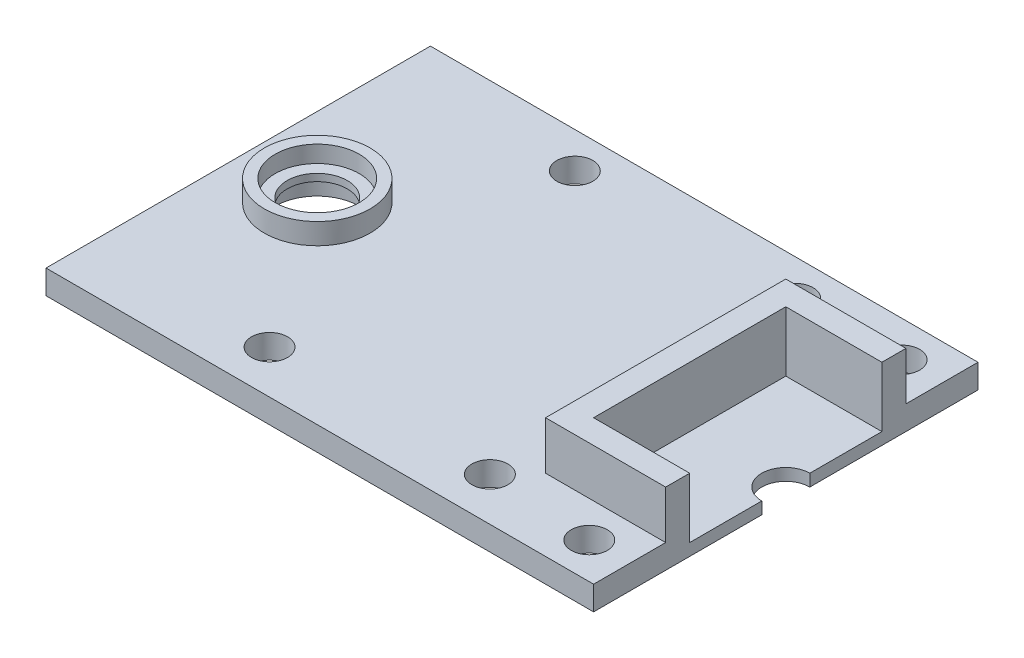
ISO-10303-21;
HEADER;
FILE_DESCRIPTION(('STEP AP214'),'2;1');
FILE_NAME('part.step','',(''),(''),'','','');
FILE_SCHEMA(('AUTOMOTIVE_DESIGN { 1 0 10303 214 1 1 1 1 }'));
ENDSEC;
DATA;
#1=APPLICATION_CONTEXT('core data for automotive mechanical design processes');
#2=APPLICATION_PROTOCOL_DEFINITION('international standard','automotive_design',2000,#1);
#3=PRODUCT_CONTEXT('',#1,'mechanical');
#4=PRODUCT('Part','Part','',(#3));
#5=PRODUCT_RELATED_PRODUCT_CATEGORY('part','',(#4));
#6=PRODUCT_DEFINITION_FORMATION('','',#4);
#7=PRODUCT_DEFINITION_CONTEXT('part definition',#1,'design');
#8=PRODUCT_DEFINITION('design','',#6,#7);
#9=PRODUCT_DEFINITION_SHAPE('','',#8);
#10=(LENGTH_UNIT() NAMED_UNIT(*) SI_UNIT(.MILLI.,.METRE.));
#11=(NAMED_UNIT(*) PLANE_ANGLE_UNIT() SI_UNIT($,.RADIAN.));
#12=(NAMED_UNIT(*) SI_UNIT($,.STERADIAN.) SOLID_ANGLE_UNIT());
#13=UNCERTAINTY_MEASURE_WITH_UNIT(LENGTH_MEASURE(1.E-05),#10,'distance_accuracy_value','');
#14=(GEOMETRIC_REPRESENTATION_CONTEXT(3) GLOBAL_UNCERTAINTY_ASSIGNED_CONTEXT((#13)) GLOBAL_UNIT_ASSIGNED_CONTEXT((#10,
#11,#12)) REPRESENTATION_CONTEXT('',''));
#15=CARTESIAN_POINT('',(0.,0.,0.));
#16=DIRECTION('',(0.,0.,1.));
#17=DIRECTION('',(1.,0.,0.));
#18=AXIS2_PLACEMENT_3D('',#15,#16,#17);
#19=CARTESIAN_POINT('',(-134.66620377136,0.,0.));
#20=DIRECTION('',(0.,1.,0.));
#21=DIRECTION('',(0.,0.,1.));
#22=AXIS2_PLACEMENT_3D('',#19,#20,#21);
#23=CYLINDRICAL_SURFACE('',#22,6.35);
#24=DIRECTION('',(0.,1.,0.));
#25=VECTOR('',#24,1.);
#26=CARTESIAN_POINT('',(-134.66620377136,0.,-6.34999999999999));
#27=LINE('',#26,#25);
#28=CARTESIAN_POINT('',(-134.66620377136,3.175,-6.35));
#29=VERTEX_POINT('',#28);
#30=CARTESIAN_POINT('',(-134.66620377136,0.,-6.35));
#31=VERTEX_POINT('',#30);
#32=EDGE_CURVE('E337',#29,#31,#27,.F.);
#33=ORIENTED_EDGE('',*,*,#32,.F.);
#34=CARTESIAN_POINT('',(-134.66620377136,3.175,0.));
#35=DIRECTION('',(0.,1.,0.));
#36=DIRECTION('',(0.,0.,1.));
#37=AXIS2_PLACEMENT_3D('',#34,#35,#36);
#38=CIRCLE('',#37,6.35);
#39=CARTESIAN_POINT('',(-134.66620377136,3.175,6.35));
#40=VERTEX_POINT('',#39);
#41=EDGE_CURVE('E194',#40,#29,#38,.F.);
#42=ORIENTED_EDGE('',*,*,#41,.F.);
#43=DIRECTION('',(0.,1.,0.));
#44=VECTOR('',#43,1.);
#45=CARTESIAN_POINT('',(-134.66620377136,0.,6.34999999999999));
#46=LINE('',#45,#44);
#47=CARTESIAN_POINT('',(-134.66620377136,0.,6.35));
#48=VERTEX_POINT('',#47);
#49=EDGE_CURVE('E357',#48,#40,#46,.T.);
#50=ORIENTED_EDGE('',*,*,#49,.F.);
#51=CARTESIAN_POINT('',(-134.66620377136,0.,0.));
#52=DIRECTION('',(0.,1.,0.));
#53=DIRECTION('',(0.,0.,1.));
#54=AXIS2_PLACEMENT_3D('',#51,#52,#53);
#55=CIRCLE('',#54,6.35);
#56=EDGE_CURVE('E253',#31,#48,#55,.T.);
#57=ORIENTED_EDGE('',*,*,#56,.F.);
#58=EDGE_LOOP('',(#33,#42,#50,#57));
#59=FACE_BOUND('',#58,.T.);
#60=ADVANCED_FACE('F52',(#59),#23,.F.);
#61=CARTESIAN_POINT('',(0.,6.35,0.));
#62=DIRECTION('',(0.,-1.,0.));
#63=DIRECTION('',(0.,0.,-1.));
#64=AXIS2_PLACEMENT_3D('',#61,#62,#63);
#65=PLANE('',#64);
#66=CARTESIAN_POINT('',(-145.33420377136,6.35,41.275));
#67=DIRECTION('',(0.,-1.,0.));
#68=DIRECTION('',(0.,0.,-1.));
#69=AXIS2_PLACEMENT_3D('',#66,#67,#68);
#70=CIRCLE('',#69,4.76250000000001);
#71=CARTESIAN_POINT('',(-145.33420377136,6.35,36.5125));
#72=VERTEX_POINT('',#71);
#73=EDGE_CURVE('E382',#72,#72,#70,.T.);
#74=ORIENTED_EDGE('',*,*,#73,.T.);
#75=EDGE_LOOP('',(#74));
#76=FACE_BOUND('',#75,.T.);
#77=CARTESIAN_POINT('',(-145.33420377136,6.35,-41.275));
#78=DIRECTION('',(0.,1.,0.));
#79=DIRECTION('',(0.,0.,1.));
#80=AXIS2_PLACEMENT_3D('',#77,#78,#79);
#81=CIRCLE('',#80,4.76250000000001);
#82=CARTESIAN_POINT('',(-145.33420377136,6.35,-36.5125));
#83=VERTEX_POINT('',#82);
#84=EDGE_CURVE('E374',#83,#83,#81,.T.);
#85=ORIENTED_EDGE('',*,*,#84,.F.);
#86=EDGE_LOOP('',(#85));
#87=FACE_BOUND('',#86,.T.);
#88=CARTESIAN_POINT('',(-258.510557856653,6.35,0.));
#89=DIRECTION('',(0.,-1.,0.));
#90=DIRECTION('',(0.,0.,-1.));
#91=AXIS2_PLACEMENT_3D('',#88,#89,#90);
#92=CIRCLE('',#91,13.97);
#93=CARTESIAN_POINT('',(-258.510557856653,6.35,-13.97));
#94=VERTEX_POINT('',#93);
#95=EDGE_CURVE('E188',#94,#94,#92,.F.);
#96=ORIENTED_EDGE('',*,*,#95,.F.);
#97=EDGE_LOOP('',(#96));
#98=FACE_BOUND('',#97,.T.);
#99=CARTESIAN_POINT('',(-231.7492444,6.35,-41.324145444));
#100=DIRECTION('',(0.,1.,0.));
#101=DIRECTION('',(0.,0.,1.));
#102=AXIS2_PLACEMENT_3D('',#99,#100,#101);
#103=CIRCLE('',#102,4.76250000000001);
#104=CARTESIAN_POINT('',(-231.7492444,6.35,-36.561645444));
#105=VERTEX_POINT('',#104);
#106=EDGE_CURVE('E306',#105,#105,#103,.T.);
#107=ORIENTED_EDGE('',*,*,#106,.F.);
#108=EDGE_LOOP('',(#107));
#109=FACE_BOUND('',#108,.T.);
#110=CARTESIAN_POINT('',(-231.7492444,6.35,39.369341378));
#111=DIRECTION('',(0.,1.,0.));
#112=DIRECTION('',(0.,0.,1.));
#113=AXIS2_PLACEMENT_3D('',#110,#111,#112);
#114=CIRCLE('',#113,4.76250000000001);
#115=CARTESIAN_POINT('',(-231.7492444,6.35,44.131841378));
#116=VERTEX_POINT('',#115);
#117=EDGE_CURVE('E325',#116,#116,#114,.T.);
#118=ORIENTED_EDGE('',*,*,#117,.F.);
#119=EDGE_LOOP('',(#118));
#120=FACE_BOUND('',#119,.T.);
#121=CARTESIAN_POINT('',(-173.509244294,6.35,39.369341378));
#122=DIRECTION('',(0.,1.,0.));
#123=DIRECTION('',(0.,0.,1.));
#124=AXIS2_PLACEMENT_3D('',#121,#122,#123);
#125=CIRCLE('',#124,4.76250000000001);
#126=CARTESIAN_POINT('',(-173.509244294,6.35,44.131841378));
#127=VERTEX_POINT('',#126);
#128=EDGE_CURVE('E315',#127,#127,#125,.T.);
#129=ORIENTED_EDGE('',*,*,#128,.F.);
#130=EDGE_LOOP('',(#129));
#131=FACE_BOUND('',#130,.T.);
#132=CARTESIAN_POINT('',(-173.509244294,6.35,-41.324145444));
#133=DIRECTION('',(0.,1.,0.));
#134=DIRECTION('',(0.,0.,1.));
#135=AXIS2_PLACEMENT_3D('',#132,#133,#134);
#136=CIRCLE('',#135,4.76250000000001);
#137=CARTESIAN_POINT('',(-173.509244294,6.35,-36.561645444));
#138=VERTEX_POINT('',#137);
#139=EDGE_CURVE('E316',#138,#138,#136,.T.);
#140=ORIENTED_EDGE('',*,*,#139,.F.);
#141=EDGE_LOOP('',(#140));
#142=FACE_BOUND('',#141,.T.);
#143=DIRECTION('',(0.,0.,1.));
#144=VECTOR('',#143,1.);
#145=CARTESIAN_POINT('',(-134.66620377136,6.35,0.));
#146=LINE('',#145,#144);
#147=CARTESIAN_POINT('',(-134.66620377136,6.35,-50.8));
#148=VERTEX_POINT('',#147);
#149=CARTESIAN_POINT('',(-134.66620377136,6.35,-31.75));
#150=VERTEX_POINT('',#149);
#151=EDGE_CURVE('E68',#148,#150,#146,.T.);
#152=ORIENTED_EDGE('',*,*,#151,.F.);
#153=DIRECTION('',(-1.,0.,0.));
#154=VECTOR('',#153,1.);
#155=CARTESIAN_POINT('',(-279.4,6.35,-50.8));
#156=LINE('',#155,#154);
#157=CARTESIAN_POINT('',(-279.4,6.35,-50.8));
#158=VERTEX_POINT('',#157);
#159=EDGE_CURVE('E217',#148,#158,#156,.T.);
#160=ORIENTED_EDGE('',*,*,#159,.T.);
#161=DIRECTION('',(0.,0.,1.));
#162=VECTOR('',#161,1.);
#163=CARTESIAN_POINT('',(-279.4,6.35,50.8));
#164=LINE('',#163,#162);
#165=CARTESIAN_POINT('',(-279.4,6.35,50.8));
#166=VERTEX_POINT('',#165);
#167=EDGE_CURVE('E227',#158,#166,#164,.T.);
#168=ORIENTED_EDGE('',*,*,#167,.T.);
#169=DIRECTION('',(1.,0.,0.));
#170=VECTOR('',#169,1.);
#171=CARTESIAN_POINT('',(-279.4,6.35,50.8));
#172=LINE('',#171,#170);
#173=CARTESIAN_POINT('',(-134.66620377136,6.35,50.8));
#174=VERTEX_POINT('',#173);
#175=EDGE_CURVE('E213',#166,#174,#172,.T.);
#176=ORIENTED_EDGE('',*,*,#175,.T.);
#177=DIRECTION('',(0.,0.,1.));
#178=VECTOR('',#177,1.);
#179=CARTESIAN_POINT('',(-134.66620377136,6.35,0.));
#180=LINE('',#179,#178);
#181=CARTESIAN_POINT('',(-134.66620377136,6.35,31.75));
#182=VERTEX_POINT('',#181);
#183=EDGE_CURVE('E360',#182,#174,#180,.T.);
#184=ORIENTED_EDGE('',*,*,#183,.F.);
#185=DIRECTION('',(1.,0.,0.));
#186=VECTOR('',#185,1.);
#187=CARTESIAN_POINT('',(-102.91620377136,6.35,31.75));
#188=LINE('',#187,#186);
#189=CARTESIAN_POINT('',(-166.41620377136,6.35,31.75));
#190=VERTEX_POINT('',#189);
#191=EDGE_CURVE('E270',#190,#182,#188,.T.);
#192=ORIENTED_EDGE('',*,*,#191,.F.);
#193=DIRECTION('',(0.,0.,1.));
#194=VECTOR('',#193,1.);
#195=CARTESIAN_POINT('',(-166.41620377136,6.35,31.75));
#196=LINE('',#195,#194);
#197=CARTESIAN_POINT('',(-166.41620377136,6.35,-31.75));
#198=VERTEX_POINT('',#197);
#199=EDGE_CURVE('E198',#198,#190,#196,.T.);
#200=ORIENTED_EDGE('',*,*,#199,.F.);
#201=DIRECTION('',(-1.,0.,0.));
#202=VECTOR('',#201,1.);
#203=CARTESIAN_POINT('',(-102.91620377136,6.35,-31.75));
#204=LINE('',#203,#202);
#205=EDGE_CURVE('E266',#150,#198,#204,.T.);
#206=ORIENTED_EDGE('',*,*,#205,.F.);
#207=EDGE_LOOP('',(#152,#160,#168,#176,#184,#192,#200,#206));
#208=FACE_BOUND('',#207,.T.);
#209=ADVANCED_FACE('F437',(#76,#87,#98,#109,#120,#131,#142,#208),#65,.F.);
#210=CARTESIAN_POINT('',(-279.4,6.35,-50.8));
#211=DIRECTION('',(0.,0.,1.));
#212=DIRECTION('',(1.,0.,0.));
#213=AXIS2_PLACEMENT_3D('',#210,#211,#212);
#214=PLANE('',#213);
#215=DIRECTION('',(0.,-1.,0.));
#216=VECTOR('',#215,1.);
#217=CARTESIAN_POINT('',(-134.66620377136,386.673855357242,-50.8));
#218=LINE('',#217,#216);
#219=CARTESIAN_POINT('',(-134.66620377136,0.,-50.8));
#220=VERTEX_POINT('',#219);
#221=EDGE_CURVE('E368',#148,#220,#218,.T.);
#222=ORIENTED_EDGE('',*,*,#221,.T.);
#223=DIRECTION('',(-1.,0.,0.));
#224=VECTOR('',#223,1.);
#225=CARTESIAN_POINT('',(-279.4,0.,-50.8));
#226=LINE('',#225,#224);
#227=CARTESIAN_POINT('',(-279.4,0.,-50.8));
#228=VERTEX_POINT('',#227);
#229=EDGE_CURVE('E221',#220,#228,#226,.T.);
#230=ORIENTED_EDGE('',*,*,#229,.T.);
#231=DIRECTION('',(0.,-1.,0.));
#232=VECTOR('',#231,1.);
#233=CARTESIAN_POINT('',(-279.4,6.35,-50.8));
#234=LINE('',#233,#232);
#235=EDGE_CURVE('E191',#158,#228,#234,.T.);
#236=ORIENTED_EDGE('',*,*,#235,.F.);
#237=ORIENTED_EDGE('',*,*,#159,.F.);
#238=EDGE_LOOP('',(#222,#230,#236,#237));
#239=FACE_BOUND('',#238,.T.);
#240=ADVANCED_FACE('F54',(#239),#214,.F.);
#241=CARTESIAN_POINT('',(-279.4,6.35,50.8));
#242=DIRECTION('',(0.,0.,-1.));
#243=DIRECTION('',(-1.,0.,0.));
#244=AXIS2_PLACEMENT_3D('',#241,#242,#243);
#245=PLANE('',#244);
#246=DIRECTION('',(0.,-1.,0.));
#247=VECTOR('',#246,1.);
#248=CARTESIAN_POINT('',(-134.66620377136,386.673855357242,50.8));
#249=LINE('',#248,#247);
#250=CARTESIAN_POINT('',(-134.66620377136,0.,50.8));
#251=VERTEX_POINT('',#250);
#252=EDGE_CURVE('E76',#174,#251,#249,.T.);
#253=ORIENTED_EDGE('',*,*,#252,.F.);
#254=ORIENTED_EDGE('',*,*,#175,.F.);
#255=DIRECTION('',(0.,-1.,0.));
#256=VECTOR('',#255,1.);
#257=CARTESIAN_POINT('',(-279.4,6.35,50.8));
#258=LINE('',#257,#256);
#259=CARTESIAN_POINT('',(-279.4,0.,50.8));
#260=VERTEX_POINT('',#259);
#261=EDGE_CURVE('E209',#166,#260,#258,.T.);
#262=ORIENTED_EDGE('',*,*,#261,.T.);
#263=DIRECTION('',(1.,0.,0.));
#264=VECTOR('',#263,1.);
#265=CARTESIAN_POINT('',(-279.4,0.,50.8));
#266=LINE('',#265,#264);
#267=EDGE_CURVE('E214',#260,#251,#266,.T.);
#268=ORIENTED_EDGE('',*,*,#267,.T.);
#269=EDGE_LOOP('',(#253,#254,#262,#268));
#270=FACE_BOUND('',#269,.T.);
#271=ADVANCED_FACE('F397',(#270),#245,.F.);
#272=CARTESIAN_POINT('',(0.,0.,0.));
#273=DIRECTION('',(0.,-1.,0.));
#274=DIRECTION('',(0.,0.,-1.));
#275=AXIS2_PLACEMENT_3D('',#272,#273,#274);
#276=PLANE('',#275);
#277=CARTESIAN_POINT('',(-145.33420377136,0.,41.275));
#278=DIRECTION('',(0.,-1.,0.));
#279=DIRECTION('',(0.,0.,-1.));
#280=AXIS2_PLACEMENT_3D('',#277,#278,#279);
#281=CIRCLE('',#280,4.76250000000001);
#282=CARTESIAN_POINT('',(-145.33420377136,0.,36.5125));
#283=VERTEX_POINT('',#282);
#284=EDGE_CURVE('E378',#283,#283,#281,.T.);
#285=ORIENTED_EDGE('',*,*,#284,.F.);
#286=EDGE_LOOP('',(#285));
#287=FACE_BOUND('',#286,.T.);
#288=CARTESIAN_POINT('',(-145.33420377136,0.,-41.275));
#289=DIRECTION('',(0.,1.,0.));
#290=DIRECTION('',(0.,0.,1.));
#291=AXIS2_PLACEMENT_3D('',#288,#289,#290);
#292=CIRCLE('',#291,4.76250000000001);
#293=CARTESIAN_POINT('',(-145.33420377136,0.,-36.5125));
#294=VERTEX_POINT('',#293);
#295=EDGE_CURVE('E373',#294,#294,#292,.T.);
#296=ORIENTED_EDGE('',*,*,#295,.T.);
#297=EDGE_LOOP('',(#296));
#298=FACE_BOUND('',#297,.T.);
#299=CARTESIAN_POINT('',(-258.510557856653,0.,0.));
#300=DIRECTION('',(0.,-1.,0.));
#301=DIRECTION('',(0.,0.,-1.));
#302=AXIS2_PLACEMENT_3D('',#299,#300,#301);
#303=CIRCLE('',#302,11.1125);
#304=CARTESIAN_POINT('',(-258.510557856653,0.,-11.1125));
#305=VERTEX_POINT('',#304);
#306=EDGE_CURVE('E203',#305,#305,#303,.T.);
#307=ORIENTED_EDGE('',*,*,#306,.F.);
#308=EDGE_LOOP('',(#307));
#309=FACE_BOUND('',#308,.T.);
#310=CARTESIAN_POINT('',(-231.7492444,0.,-41.324145444));
#311=DIRECTION('',(0.,-1.,0.));
#312=DIRECTION('',(0.,0.,-1.));
#313=AXIS2_PLACEMENT_3D('',#310,#311,#312);
#314=CIRCLE('',#313,4.76250000000001);
#315=CARTESIAN_POINT('',(-231.7492444,0.,-46.086645444));
#316=VERTEX_POINT('',#315);
#317=EDGE_CURVE('E294',#316,#316,#314,.F.);
#318=ORIENTED_EDGE('',*,*,#317,.T.);
#319=EDGE_LOOP('',(#318));
#320=FACE_BOUND('',#319,.T.);
#321=CARTESIAN_POINT('',(-231.7492444,0.,39.369341378));
#322=DIRECTION('',(0.,-1.,0.));
#323=DIRECTION('',(0.,0.,-1.));
#324=AXIS2_PLACEMENT_3D('',#321,#322,#323);
#325=CIRCLE('',#324,4.76250000000001);
#326=CARTESIAN_POINT('',(-231.7492444,0.,34.606841378));
#327=VERTEX_POINT('',#326);
#328=EDGE_CURVE('E310',#327,#327,#325,.F.);
#329=ORIENTED_EDGE('',*,*,#328,.T.);
#330=EDGE_LOOP('',(#329));
#331=FACE_BOUND('',#330,.T.);
#332=CARTESIAN_POINT('',(-173.509244294,0.,39.369341378));
#333=DIRECTION('',(0.,-1.,0.));
#334=DIRECTION('',(0.,0.,-1.));
#335=AXIS2_PLACEMENT_3D('',#332,#333,#334);
#336=CIRCLE('',#335,4.76250000000001);
#337=CARTESIAN_POINT('',(-173.509244294,0.,34.606841378));
#338=VERTEX_POINT('',#337);
#339=EDGE_CURVE('E321',#338,#338,#336,.F.);
#340=ORIENTED_EDGE('',*,*,#339,.T.);
#341=EDGE_LOOP('',(#340));
#342=FACE_BOUND('',#341,.T.);
#343=CARTESIAN_POINT('',(-173.509244294,0.,-41.324145444));
#344=DIRECTION('',(0.,-1.,0.));
#345=DIRECTION('',(0.,0.,-1.));
#346=AXIS2_PLACEMENT_3D('',#343,#344,#345);
#347=CIRCLE('',#346,4.76250000000001);
#348=CARTESIAN_POINT('',(-173.509244294,0.,-46.086645444));
#349=VERTEX_POINT('',#348);
#350=EDGE_CURVE('E311',#349,#349,#347,.F.);
#351=ORIENTED_EDGE('',*,*,#350,.T.);
#352=EDGE_LOOP('',(#351));
#353=FACE_BOUND('',#352,.T.);
#354=ORIENTED_EDGE('',*,*,#229,.F.);
#355=DIRECTION('',(0.,0.,1.));
#356=VECTOR('',#355,1.);
#357=CARTESIAN_POINT('',(-134.66620377136,0.,0.));
#358=LINE('',#357,#356);
#359=EDGE_CURVE('E320',#220,#31,#358,.T.);
#360=ORIENTED_EDGE('',*,*,#359,.T.);
#361=ORIENTED_EDGE('',*,*,#56,.T.);
#362=DIRECTION('',(0.,0.,1.));
#363=VECTOR('',#362,1.);
#364=CARTESIAN_POINT('',(-134.66620377136,0.,0.));
#365=LINE('',#364,#363);
#366=EDGE_CURVE('E354',#48,#251,#365,.T.);
#367=ORIENTED_EDGE('',*,*,#366,.T.);
#368=ORIENTED_EDGE('',*,*,#267,.F.);
#369=DIRECTION('',(0.,0.,1.));
#370=VECTOR('',#369,1.);
#371=CARTESIAN_POINT('',(-279.4,0.,50.8));
#372=LINE('',#371,#370);
#373=EDGE_CURVE('E218',#228,#260,#372,.T.);
#374=ORIENTED_EDGE('',*,*,#373,.F.);
#375=EDGE_LOOP('',(#354,#360,#361,#367,#368,#374));
#376=FACE_BOUND('',#375,.T.);
#377=ADVANCED_FACE('F393',(#287,#298,#309,#320,#331,#342,#353,#376),#276,.T.);
#378=CARTESIAN_POINT('',(-102.91620377136,19.05,31.75));
#379=DIRECTION('',(0.,0.,-1.));
#380=DIRECTION('',(-1.,0.,0.));
#381=AXIS2_PLACEMENT_3D('',#378,#379,#380);
#382=PLANE('',#381);
#383=DIRECTION('',(0.,-1.,0.));
#384=VECTOR('',#383,1.);
#385=CARTESIAN_POINT('',(-134.66620377136,19.05,31.75));
#386=LINE('',#385,#384);
#387=CARTESIAN_POINT('',(-134.66620377136,19.05,31.75));
#388=VERTEX_POINT('',#387);
#389=EDGE_CURVE('E180',#388,#182,#386,.T.);
#390=ORIENTED_EDGE('',*,*,#389,.F.);
#391=DIRECTION('',(1.,0.,0.));
#392=VECTOR('',#391,1.);
#393=CARTESIAN_POINT('',(-102.91620377136,19.05,31.75));
#394=LINE('',#393,#392);
#395=CARTESIAN_POINT('',(-166.41620377136,19.05,31.75));
#396=VERTEX_POINT('',#395);
#397=EDGE_CURVE('E176',#396,#388,#394,.T.);
#398=ORIENTED_EDGE('',*,*,#397,.F.);
#399=DIRECTION('',(0.,-1.,0.));
#400=VECTOR('',#399,1.);
#401=CARTESIAN_POINT('',(-166.41620377136,19.05,31.75));
#402=LINE('',#401,#400);
#403=EDGE_CURVE('E257',#396,#190,#402,.T.);
#404=ORIENTED_EDGE('',*,*,#403,.T.);
#405=ORIENTED_EDGE('',*,*,#191,.T.);
#406=EDGE_LOOP('',(#390,#398,#404,#405));
#407=FACE_BOUND('',#406,.T.);
#408=ADVANCED_FACE('F396',(#407),#382,.F.);
#409=CARTESIAN_POINT('',(-102.91620377136,19.05,-31.75));
#410=DIRECTION('',(0.,0.,1.));
#411=DIRECTION('',(1.,0.,0.));
#412=AXIS2_PLACEMENT_3D('',#409,#410,#411);
#413=PLANE('',#412);
#414=DIRECTION('',(0.,1.,0.));
#415=VECTOR('',#414,1.);
#416=CARTESIAN_POINT('',(-134.66620377136,19.05,-31.75));
#417=LINE('',#416,#415);
#418=CARTESIAN_POINT('',(-134.66620377136,19.05,-31.75));
#419=VERTEX_POINT('',#418);
#420=EDGE_CURVE('E343',#150,#419,#417,.T.);
#421=ORIENTED_EDGE('',*,*,#420,.F.);
#422=ORIENTED_EDGE('',*,*,#205,.T.);
#423=DIRECTION('',(0.,-1.,0.));
#424=VECTOR('',#423,1.);
#425=CARTESIAN_POINT('',(-166.41620377136,19.05,-31.75));
#426=LINE('',#425,#424);
#427=CARTESIAN_POINT('',(-166.41620377136,19.05,-31.75));
#428=VERTEX_POINT('',#427);
#429=EDGE_CURVE('E261',#428,#198,#426,.T.);
#430=ORIENTED_EDGE('',*,*,#429,.F.);
#431=DIRECTION('',(-1.,0.,0.));
#432=VECTOR('',#431,1.);
#433=CARTESIAN_POINT('',(-102.91620377136,19.05,-31.75));
#434=LINE('',#433,#432);
#435=EDGE_CURVE('E265',#419,#428,#434,.T.);
#436=ORIENTED_EDGE('',*,*,#435,.F.);
#437=EDGE_LOOP('',(#421,#422,#430,#436));
#438=FACE_BOUND('',#437,.T.);
#439=ADVANCED_FACE('F434',(#438),#413,.F.);
#440=CARTESIAN_POINT('',(0.,19.05,0.));
#441=DIRECTION('',(0.,1.,0.));
#442=DIRECTION('',(0.,0.,1.));
#443=AXIS2_PLACEMENT_3D('',#440,#441,#442);
#444=PLANE('',#443);
#445=DIRECTION('',(-1.,0.,0.));
#446=VECTOR('',#445,1.);
#447=CARTESIAN_POINT('',(-109.26620377136,19.05,-25.4));
#448=LINE('',#447,#446);
#449=CARTESIAN_POINT('',(-134.66620377136,19.05,-25.4));
#450=VERTEX_POINT('',#449);
#451=CARTESIAN_POINT('',(-160.06620377136,19.05,-25.4));
#452=VERTEX_POINT('',#451);
#453=EDGE_CURVE('E167',#450,#452,#448,.T.);
#454=ORIENTED_EDGE('',*,*,#453,.F.);
#455=DIRECTION('',(0.,0.,-1.));
#456=VECTOR('',#455,1.);
#457=CARTESIAN_POINT('',(-134.66620377136,19.05,0.));
#458=LINE('',#457,#456);
#459=EDGE_CURVE('E347',#450,#419,#458,.T.);
#460=ORIENTED_EDGE('',*,*,#459,.T.);
#461=ORIENTED_EDGE('',*,*,#435,.T.);
#462=DIRECTION('',(0.,0.,1.));
#463=VECTOR('',#462,1.);
#464=CARTESIAN_POINT('',(-166.41620377136,19.05,31.75));
#465=LINE('',#464,#463);
#466=EDGE_CURVE('E269',#428,#396,#465,.T.);
#467=ORIENTED_EDGE('',*,*,#466,.T.);
#468=ORIENTED_EDGE('',*,*,#397,.T.);
#469=DIRECTION('',(0.,0.,-1.));
#470=VECTOR('',#469,1.);
#471=CARTESIAN_POINT('',(-134.66620377136,19.05,0.));
#472=LINE('',#471,#470);
#473=CARTESIAN_POINT('',(-134.66620377136,19.05,25.4));
#474=VERTEX_POINT('',#473);
#475=EDGE_CURVE('E172',#388,#474,#472,.T.);
#476=ORIENTED_EDGE('',*,*,#475,.T.);
#477=DIRECTION('',(1.,0.,0.));
#478=VECTOR('',#477,1.);
#479=CARTESIAN_POINT('',(-109.26620377136,19.05,25.4));
#480=LINE('',#479,#478);
#481=CARTESIAN_POINT('',(-160.06620377136,19.05,25.4));
#482=VERTEX_POINT('',#481);
#483=EDGE_CURVE('E157',#482,#474,#480,.T.);
#484=ORIENTED_EDGE('',*,*,#483,.F.);
#485=DIRECTION('',(0.,0.,1.));
#486=VECTOR('',#485,1.);
#487=CARTESIAN_POINT('',(-160.06620377136,19.05,25.4));
#488=LINE('',#487,#486);
#489=EDGE_CURVE('E168',#452,#482,#488,.T.);
#490=ORIENTED_EDGE('',*,*,#489,.F.);
#491=EDGE_LOOP('',(#454,#460,#461,#467,#468,#476,#484,#490));
#492=FACE_BOUND('',#491,.T.);
#493=ADVANCED_FACE('F174',(#492),#444,.T.);
#494=CARTESIAN_POINT('',(0.,3.175,0.));
#495=DIRECTION('',(0.,1.,0.));
#496=DIRECTION('',(0.,0.,1.));
#497=AXIS2_PLACEMENT_3D('',#494,#495,#496);
#498=PLANE('',#497);
#499=ORIENTED_EDGE('',*,*,#41,.T.);
#500=DIRECTION('',(0.,0.,-1.));
#501=VECTOR('',#500,1.);
#502=CARTESIAN_POINT('',(-134.66620377136,3.175,0.));
#503=LINE('',#502,#501);
#504=CARTESIAN_POINT('',(-134.66620377136,3.175,-25.4));
#505=VERTEX_POINT('',#504);
#506=EDGE_CURVE('E350',#29,#505,#503,.T.);
#507=ORIENTED_EDGE('',*,*,#506,.T.);
#508=DIRECTION('',(-1.,0.,0.));
#509=VECTOR('',#508,1.);
#510=CARTESIAN_POINT('',(-109.26620377136,3.175,-25.4));
#511=LINE('',#510,#509);
#512=CARTESIAN_POINT('',(-160.06620377136,3.175,-25.4));
#513=VERTEX_POINT('',#512);
#514=EDGE_CURVE('E285',#505,#513,#511,.T.);
#515=ORIENTED_EDGE('',*,*,#514,.T.);
#516=DIRECTION('',(0.,0.,1.));
#517=VECTOR('',#516,1.);
#518=CARTESIAN_POINT('',(-160.06620377136,3.175,25.4));
#519=LINE('',#518,#517);
#520=CARTESIAN_POINT('',(-160.06620377136,3.175,25.4));
#521=VERTEX_POINT('',#520);
#522=EDGE_CURVE('E290',#513,#521,#519,.T.);
#523=ORIENTED_EDGE('',*,*,#522,.T.);
#524=DIRECTION('',(1.,0.,0.));
#525=VECTOR('',#524,1.);
#526=CARTESIAN_POINT('',(-109.26620377136,3.175,25.4));
#527=LINE('',#526,#525);
#528=CARTESIAN_POINT('',(-134.66620377136,3.175,25.4));
#529=VERTEX_POINT('',#528);
#530=EDGE_CURVE('E297',#521,#529,#527,.T.);
#531=ORIENTED_EDGE('',*,*,#530,.T.);
#532=DIRECTION('',(0.,0.,-1.));
#533=VECTOR('',#532,1.);
#534=CARTESIAN_POINT('',(-134.66620377136,3.175,0.));
#535=LINE('',#534,#533);
#536=EDGE_CURVE('E181',#529,#40,#535,.T.);
#537=ORIENTED_EDGE('',*,*,#536,.T.);
#538=EDGE_LOOP('',(#499,#507,#515,#523,#531,#537));
#539=FACE_BOUND('',#538,.T.);
#540=ADVANCED_FACE('F425',(#539),#498,.T.);
#541=CARTESIAN_POINT('',(-109.26620377136,3.175,-25.4));
#542=DIRECTION('',(0.,0.,-1.));
#543=DIRECTION('',(-1.,0.,0.));
#544=AXIS2_PLACEMENT_3D('',#541,#542,#543);
#545=PLANE('',#544);
#546=DIRECTION('',(0.,-1.,0.));
#547=VECTOR('',#546,1.);
#548=CARTESIAN_POINT('',(-134.66620377136,3.175,-25.4));
#549=LINE('',#548,#547);
#550=EDGE_CURVE('E13',#450,#505,#549,.T.);
#551=ORIENTED_EDGE('',*,*,#550,.F.);
#552=ORIENTED_EDGE('',*,*,#453,.T.);
#553=DIRECTION('',(0.,1.,0.));
#554=VECTOR('',#553,1.);
#555=CARTESIAN_POINT('',(-160.06620377136,3.175,-25.4));
#556=LINE('',#555,#554);
#557=EDGE_CURVE('E199',#513,#452,#556,.T.);
#558=ORIENTED_EDGE('',*,*,#557,.F.);
#559=ORIENTED_EDGE('',*,*,#514,.F.);
#560=EDGE_LOOP('',(#551,#552,#558,#559));
#561=FACE_BOUND('',#560,.T.);
#562=ADVANCED_FACE('F493',(#561),#545,.F.);
#563=CARTESIAN_POINT('',(-109.26620377136,3.175,25.4));
#564=DIRECTION('',(0.,0.,1.));
#565=DIRECTION('',(1.,0.,0.));
#566=AXIS2_PLACEMENT_3D('',#563,#564,#565);
#567=PLANE('',#566);
#568=DIRECTION('',(0.,1.,0.));
#569=VECTOR('',#568,1.);
#570=CARTESIAN_POINT('',(-134.66620377136,3.175,25.4));
#571=LINE('',#570,#569);
#572=EDGE_CURVE('E61',#529,#474,#571,.T.);
#573=ORIENTED_EDGE('',*,*,#572,.F.);
#574=ORIENTED_EDGE('',*,*,#530,.F.);
#575=DIRECTION('',(0.,1.,0.));
#576=VECTOR('',#575,1.);
#577=CARTESIAN_POINT('',(-160.06620377136,3.175,25.4));
#578=LINE('',#577,#576);
#579=EDGE_CURVE('E163',#521,#482,#578,.T.);
#580=ORIENTED_EDGE('',*,*,#579,.T.);
#581=ORIENTED_EDGE('',*,*,#483,.T.);
#582=EDGE_LOOP('',(#573,#574,#580,#581));
#583=FACE_BOUND('',#582,.T.);
#584=ADVANCED_FACE('F159',(#583),#567,.F.);
#585=CARTESIAN_POINT('',(-279.4,6.35,50.8));
#586=DIRECTION('',(1.,0.,0.));
#587=DIRECTION('',(0.,0.,-1.));
#588=AXIS2_PLACEMENT_3D('',#585,#586,#587);
#589=PLANE('',#588);
#590=ORIENTED_EDGE('',*,*,#373,.T.);
#591=ORIENTED_EDGE('',*,*,#261,.F.);
#592=ORIENTED_EDGE('',*,*,#167,.F.);
#593=ORIENTED_EDGE('',*,*,#235,.T.);
#594=EDGE_LOOP('',(#590,#591,#592,#593));
#595=FACE_BOUND('',#594,.T.);
#596=ADVANCED_FACE('F446',(#595),#589,.F.);
#597=CARTESIAN_POINT('',(-258.510557856653,11.90625,0.));
#598=DIRECTION('',(0.,-1.,0.));
#599=DIRECTION('',(0.,0.,-1.));
#600=AXIS2_PLACEMENT_3D('',#597,#598,#599);
#601=CYLINDRICAL_SURFACE('',#600,13.97);
#602=CARTESIAN_POINT('',(-258.510557856653,11.90625,0.));
#603=DIRECTION('',(0.,1.,0.));
#604=DIRECTION('',(0.,0.,1.));
#605=AXIS2_PLACEMENT_3D('',#602,#603,#604);
#606=CIRCLE('',#605,13.97);
#607=CARTESIAN_POINT('',(-258.510557856653,11.90625,13.97));
#608=VERTEX_POINT('',#607);
#609=EDGE_CURVE('E224',#608,#608,#606,.T.);
#610=ORIENTED_EDGE('',*,*,#609,.F.);
#611=EDGE_LOOP('',(#610));
#612=FACE_BOUND('',#611,.T.);
#613=ORIENTED_EDGE('',*,*,#95,.T.);
#614=EDGE_LOOP('',(#613));
#615=FACE_BOUND('',#614,.T.);
#616=ADVANCED_FACE('F485',(#612,#615),#601,.T.);
#617=CARTESIAN_POINT('',(-258.510557856653,11.90625,0.));
#618=DIRECTION('',(0.,1.,0.));
#619=DIRECTION('',(0.,0.,1.));
#620=AXIS2_PLACEMENT_3D('',#617,#618,#619);
#621=PLANE('',#620);
#622=CARTESIAN_POINT('',(-258.510557856653,11.90625,0.));
#623=DIRECTION('',(0.,1.,0.));
#624=DIRECTION('',(0.,0.,1.));
#625=AXIS2_PLACEMENT_3D('',#622,#623,#624);
#626=CIRCLE('',#625,11.1125);
#627=CARTESIAN_POINT('',(-258.510557856653,11.90625,11.1125));
#628=VERTEX_POINT('',#627);
#629=EDGE_CURVE('E236',#628,#628,#626,.T.);
#630=ORIENTED_EDGE('',*,*,#629,.F.);
#631=EDGE_LOOP('',(#630));
#632=FACE_BOUND('',#631,.T.);
#633=ORIENTED_EDGE('',*,*,#609,.T.);
#634=EDGE_LOOP('',(#633));
#635=FACE_BOUND('',#634,.T.);
#636=ADVANCED_FACE('F481',(#632,#635),#621,.T.);
#637=CARTESIAN_POINT('',(-258.510557856653,7.46125,0.));
#638=DIRECTION('',(0.,1.,0.));
#639=DIRECTION('',(0.,0.,1.));
#640=AXIS2_PLACEMENT_3D('',#637,#638,#639);
#641=CYLINDRICAL_SURFACE('',#640,11.1125);
#642=CARTESIAN_POINT('',(-258.510557856653,7.46125,0.));
#643=DIRECTION('',(0.,1.,0.));
#644=DIRECTION('',(0.,0.,1.));
#645=AXIS2_PLACEMENT_3D('',#642,#643,#644);
#646=CIRCLE('',#645,11.1125);
#647=CARTESIAN_POINT('',(-258.510557856653,7.46125,11.1125));
#648=VERTEX_POINT('',#647);
#649=EDGE_CURVE('E235',#648,#648,#646,.T.);
#650=ORIENTED_EDGE('',*,*,#649,.F.);
#651=EDGE_LOOP('',(#650));
#652=FACE_BOUND('',#651,.T.);
#653=ORIENTED_EDGE('',*,*,#629,.T.);
#654=EDGE_LOOP('',(#653));
#655=FACE_BOUND('',#654,.T.);
#656=ADVANCED_FACE('F477',(#652,#655),#641,.F.);
#657=CARTESIAN_POINT('',(-258.510557856653,7.46125,0.));
#658=DIRECTION('',(0.,1.,0.));
#659=DIRECTION('',(0.,0.,1.));
#660=AXIS2_PLACEMENT_3D('',#657,#658,#659);
#661=PLANE('',#660);
#662=CARTESIAN_POINT('',(-258.510557856653,7.46125,0.));
#663=DIRECTION('',(0.,1.,0.));
#664=DIRECTION('',(0.,0.,1.));
#665=AXIS2_PLACEMENT_3D('',#662,#663,#664);
#666=CIRCLE('',#665,7.93749999999998);
#667=CARTESIAN_POINT('',(-258.510557856653,7.46125,7.93749999999998));
#668=VERTEX_POINT('',#667);
#669=EDGE_CURVE('E204',#668,#668,#666,.T.);
#670=ORIENTED_EDGE('',*,*,#669,.F.);
#671=EDGE_LOOP('',(#670));
#672=FACE_BOUND('',#671,.T.);
#673=ORIENTED_EDGE('',*,*,#649,.T.);
#674=EDGE_LOOP('',(#673));
#675=FACE_BOUND('',#674,.T.);
#676=ADVANCED_FACE('F473',(#672,#675),#661,.T.);
#677=CARTESIAN_POINT('',(-258.510557856653,5.55625,0.));
#678=DIRECTION('',(0.,-1.,0.));
#679=DIRECTION('',(0.,0.,-1.));
#680=AXIS2_PLACEMENT_3D('',#677,#678,#679);
#681=CYLINDRICAL_SURFACE('',#680,11.1125);
#682=CARTESIAN_POINT('',(-258.510557856653,5.55625,0.));
#683=DIRECTION('',(0.,-1.,0.));
#684=DIRECTION('',(0.,0.,-1.));
#685=AXIS2_PLACEMENT_3D('',#682,#683,#684);
#686=CIRCLE('',#685,11.1125);
#687=CARTESIAN_POINT('',(-258.510557856653,5.55625,-11.1125));
#688=VERTEX_POINT('',#687);
#689=EDGE_CURVE('E240',#688,#688,#686,.T.);
#690=ORIENTED_EDGE('',*,*,#689,.F.);
#691=EDGE_LOOP('',(#690));
#692=FACE_BOUND('',#691,.T.);
#693=ORIENTED_EDGE('',*,*,#306,.T.);
#694=EDGE_LOOP('',(#693));
#695=FACE_BOUND('',#694,.T.);
#696=ADVANCED_FACE('F469',(#692,#695),#681,.F.);
#697=CARTESIAN_POINT('',(-258.510557856653,5.55625,0.));
#698=DIRECTION('',(0.,-1.,0.));
#699=DIRECTION('',(0.,0.,-1.));
#700=AXIS2_PLACEMENT_3D('',#697,#698,#699);
#701=PLANE('',#700);
#702=CARTESIAN_POINT('',(-258.510557856653,5.55625,0.));
#703=DIRECTION('',(0.,-1.,0.));
#704=DIRECTION('',(0.,0.,-1.));
#705=AXIS2_PLACEMENT_3D('',#702,#703,#704);
#706=CIRCLE('',#705,7.93749999999998);
#707=CARTESIAN_POINT('',(-258.510557856653,5.55625,-7.93749999999998));
#708=VERTEX_POINT('',#707);
#709=EDGE_CURVE('E200',#708,#708,#706,.T.);
#710=ORIENTED_EDGE('',*,*,#709,.F.);
#711=EDGE_LOOP('',(#710));
#712=FACE_BOUND('',#711,.T.);
#713=ORIENTED_EDGE('',*,*,#689,.T.);
#714=EDGE_LOOP('',(#713));
#715=FACE_BOUND('',#714,.T.);
#716=ADVANCED_FACE('F465',(#712,#715),#701,.T.);
#717=CARTESIAN_POINT('',(-258.510557856653,0.,0.));
#718=DIRECTION('',(0.,1.,0.));
#719=DIRECTION('',(0.,0.,1.));
#720=AXIS2_PLACEMENT_3D('',#717,#718,#719);
#721=CYLINDRICAL_SURFACE('',#720,7.93749999999998);
#722=ORIENTED_EDGE('',*,*,#709,.T.);
#723=EDGE_LOOP('',(#722));
#724=FACE_BOUND('',#723,.T.);
#725=ORIENTED_EDGE('',*,*,#669,.T.);
#726=EDGE_LOOP('',(#725));
#727=FACE_BOUND('',#726,.T.);
#728=ADVANCED_FACE('F462',(#724,#727),#721,.F.);
#729=CARTESIAN_POINT('',(-166.41620377136,19.05,31.75));
#730=DIRECTION('',(1.,0.,0.));
#731=DIRECTION('',(0.,0.,-1.));
#732=AXIS2_PLACEMENT_3D('',#729,#730,#731);
#733=PLANE('',#732);
#734=ORIENTED_EDGE('',*,*,#199,.T.);
#735=ORIENTED_EDGE('',*,*,#403,.F.);
#736=ORIENTED_EDGE('',*,*,#466,.F.);
#737=ORIENTED_EDGE('',*,*,#429,.T.);
#738=EDGE_LOOP('',(#734,#735,#736,#737));
#739=FACE_BOUND('',#738,.T.);
#740=ADVANCED_FACE('F441',(#739),#733,.F.);
#741=CARTESIAN_POINT('',(-160.06620377136,3.175,25.4));
#742=DIRECTION('',(-1.,0.,0.));
#743=DIRECTION('',(0.,0.,1.));
#744=AXIS2_PLACEMENT_3D('',#741,#742,#743);
#745=PLANE('',#744);
#746=ORIENTED_EDGE('',*,*,#489,.T.);
#747=ORIENTED_EDGE('',*,*,#579,.F.);
#748=ORIENTED_EDGE('',*,*,#522,.F.);
#749=ORIENTED_EDGE('',*,*,#557,.T.);
#750=EDGE_LOOP('',(#746,#747,#748,#749));
#751=FACE_BOUND('',#750,.T.);
#752=ADVANCED_FACE('F429',(#751),#745,.F.);
#753=CARTESIAN_POINT('',(-231.7492444,-13.4703841816037,-41.324145444));
#754=DIRECTION('',(0.,1.,0.));
#755=DIRECTION('',(0.,0.,1.));
#756=AXIS2_PLACEMENT_3D('',#753,#754,#755);
#757=CYLINDRICAL_SURFACE('',#756,4.76250000000001);
#758=ORIENTED_EDGE('',*,*,#106,.T.);
#759=EDGE_LOOP('',(#758));
#760=FACE_BOUND('',#759,.T.);
#761=ORIENTED_EDGE('',*,*,#317,.F.);
#762=EDGE_LOOP('',(#761));
#763=FACE_BOUND('',#762,.T.);
#764=ADVANCED_FACE('F503',(#760,#763),#757,.F.);
#765=CARTESIAN_POINT('',(-231.7492444,-13.4703841816037,39.369341378));
#766=DIRECTION('',(0.,1.,0.));
#767=DIRECTION('',(0.,0.,1.));
#768=AXIS2_PLACEMENT_3D('',#765,#766,#767);
#769=CYLINDRICAL_SURFACE('',#768,4.76250000000001);
#770=ORIENTED_EDGE('',*,*,#117,.T.);
#771=EDGE_LOOP('',(#770));
#772=FACE_BOUND('',#771,.T.);
#773=ORIENTED_EDGE('',*,*,#328,.F.);
#774=EDGE_LOOP('',(#773));
#775=FACE_BOUND('',#774,.T.);
#776=ADVANCED_FACE('F589',(#772,#775),#769,.F.);
#777=CARTESIAN_POINT('',(-173.509244294,-13.4703841816037,39.369341378));
#778=DIRECTION('',(0.,1.,0.));
#779=DIRECTION('',(0.,0.,1.));
#780=AXIS2_PLACEMENT_3D('',#777,#778,#779);
#781=CYLINDRICAL_SURFACE('',#780,4.76250000000001);
#782=ORIENTED_EDGE('',*,*,#128,.T.);
#783=EDGE_LOOP('',(#782));
#784=FACE_BOUND('',#783,.T.);
#785=ORIENTED_EDGE('',*,*,#339,.F.);
#786=EDGE_LOOP('',(#785));
#787=FACE_BOUND('',#786,.T.);
#788=ADVANCED_FACE('F592',(#784,#787),#781,.F.);
#789=CARTESIAN_POINT('',(-173.509244294,-13.4703841816037,-41.324145444));
#790=DIRECTION('',(0.,1.,0.));
#791=DIRECTION('',(0.,0.,1.));
#792=AXIS2_PLACEMENT_3D('',#789,#790,#791);
#793=CYLINDRICAL_SURFACE('',#792,4.76250000000001);
#794=ORIENTED_EDGE('',*,*,#139,.T.);
#795=EDGE_LOOP('',(#794));
#796=FACE_BOUND('',#795,.T.);
#797=ORIENTED_EDGE('',*,*,#350,.F.);
#798=EDGE_LOOP('',(#797));
#799=FACE_BOUND('',#798,.T.);
#800=ADVANCED_FACE('F544',(#796,#799),#793,.F.);
#801=CARTESIAN_POINT('',(-134.66620377136,386.673855357242,0.));
#802=DIRECTION('',(1.,0.,0.));
#803=DIRECTION('',(0.,0.,-1.));
#804=AXIS2_PLACEMENT_3D('',#801,#802,#803);
#805=PLANE('',#804);
#806=ORIENTED_EDGE('',*,*,#366,.F.);
#807=ORIENTED_EDGE('',*,*,#49,.T.);
#808=ORIENTED_EDGE('',*,*,#536,.F.);
#809=ORIENTED_EDGE('',*,*,#572,.T.);
#810=ORIENTED_EDGE('',*,*,#475,.F.);
#811=ORIENTED_EDGE('',*,*,#389,.T.);
#812=ORIENTED_EDGE('',*,*,#183,.T.);
#813=ORIENTED_EDGE('',*,*,#252,.T.);
#814=EDGE_LOOP('',(#806,#807,#808,#809,#810,#811,#812,#813));
#815=FACE_BOUND('',#814,.T.);
#816=ADVANCED_FACE('F185',(#815),#805,.T.);
#817=CARTESIAN_POINT('',(-134.66620377136,386.673855357242,0.));
#818=DIRECTION('',(1.,0.,0.));
#819=DIRECTION('',(0.,0.,-1.));
#820=AXIS2_PLACEMENT_3D('',#817,#818,#819);
#821=PLANE('',#820);
#822=ORIENTED_EDGE('',*,*,#359,.F.);
#823=ORIENTED_EDGE('',*,*,#221,.F.);
#824=ORIENTED_EDGE('',*,*,#151,.T.);
#825=ORIENTED_EDGE('',*,*,#420,.T.);
#826=ORIENTED_EDGE('',*,*,#459,.F.);
#827=ORIENTED_EDGE('',*,*,#550,.T.);
#828=ORIENTED_EDGE('',*,*,#506,.F.);
#829=ORIENTED_EDGE('',*,*,#32,.T.);
#830=EDGE_LOOP('',(#822,#823,#824,#825,#826,#827,#828,#829));
#831=FACE_BOUND('',#830,.T.);
#832=ADVANCED_FACE('F420',(#831),#821,.T.);
#833=CARTESIAN_POINT('',(-145.33420377136,0.,-41.275));
#834=DIRECTION('',(0.,1.,0.));
#835=DIRECTION('',(0.,0.,1.));
#836=AXIS2_PLACEMENT_3D('',#833,#834,#835);
#837=CYLINDRICAL_SURFACE('',#836,4.76250000000001);
#838=ORIENTED_EDGE('',*,*,#295,.F.);
#839=EDGE_LOOP('',(#838));
#840=FACE_BOUND('',#839,.T.);
#841=ORIENTED_EDGE('',*,*,#84,.T.);
#842=EDGE_LOOP('',(#841));
#843=FACE_BOUND('',#842,.T.);
#844=ADVANCED_FACE('F555',(#840,#843),#837,.F.);
#845=CARTESIAN_POINT('',(-145.33420377136,0.,41.275));
#846=DIRECTION('',(0.,1.,0.));
#847=DIRECTION('',(0.,0.,1.));
#848=AXIS2_PLACEMENT_3D('',#845,#846,#847);
#849=CYLINDRICAL_SURFACE('',#848,4.76250000000001);
#850=ORIENTED_EDGE('',*,*,#284,.T.);
#851=EDGE_LOOP('',(#850));
#852=FACE_BOUND('',#851,.T.);
#853=ORIENTED_EDGE('',*,*,#73,.F.);
#854=EDGE_LOOP('',(#853));
#855=FACE_BOUND('',#854,.T.);
#856=ADVANCED_FACE('F390',(#852,#855),#849,.F.);
#857=CLOSED_SHELL('',(#60,#209,#240,#271,#377,#408,#439,#493,#540,#562,#584,#596,#616,#636,#656,
#676,#696,#716,#728,#740,#752,#764,#776,#788,#800,#816,#832,#844,#856));
#858=MANIFOLD_SOLID_BREP('B2',#857);
#859=ADVANCED_BREP_SHAPE_REPRESENTATION('',(#18,#858),#14);
#860=SHAPE_DEFINITION_REPRESENTATION(#9,#859);
ENDSEC;
END-ISO-10303-21;
